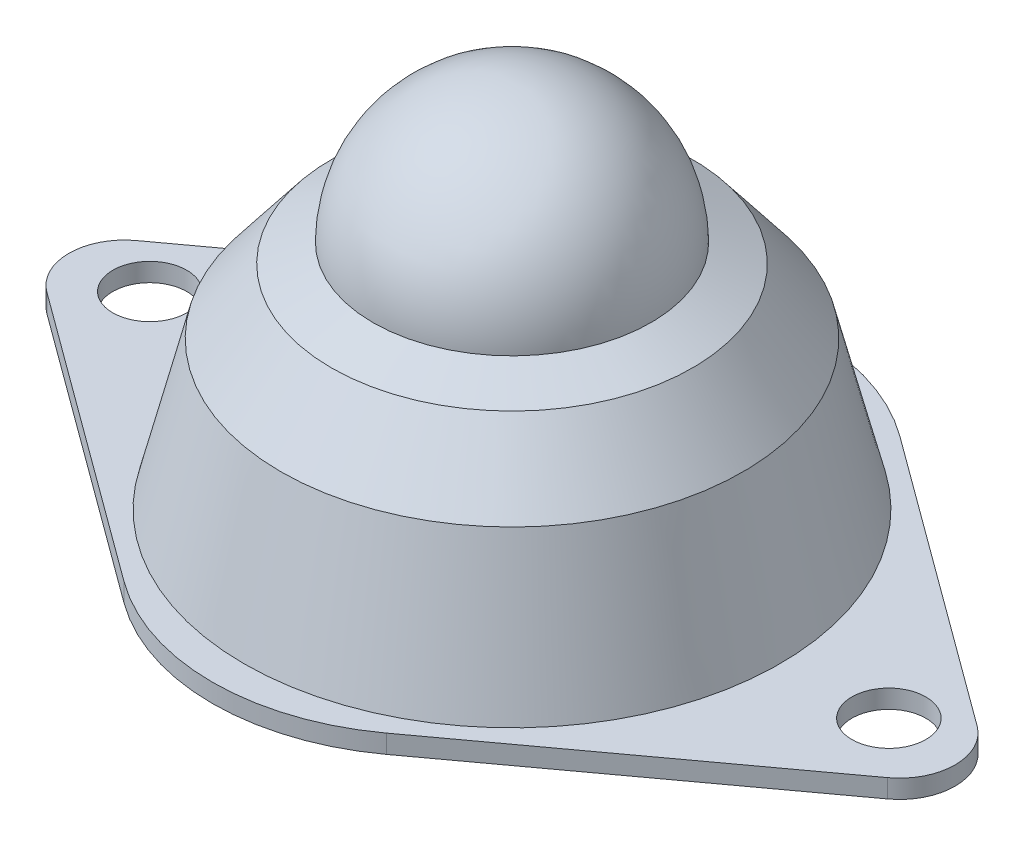
ISO-10303-21;
HEADER;
FILE_DESCRIPTION(('STEP AP214'),'2;1');
FILE_NAME('part.step','',(''),(''),'','','');
FILE_SCHEMA(('AUTOMOTIVE_DESIGN { 1 0 10303 214 1 1 1 1 }'));
ENDSEC;
DATA;
#1=APPLICATION_CONTEXT('core data for automotive mechanical design processes');
#2=APPLICATION_PROTOCOL_DEFINITION('international standard','automotive_design',2000,#1);
#3=PRODUCT_CONTEXT('',#1,'mechanical');
#4=PRODUCT('Part','Part','',(#3));
#5=PRODUCT_RELATED_PRODUCT_CATEGORY('part','',(#4));
#6=PRODUCT_DEFINITION_FORMATION('','',#4);
#7=PRODUCT_DEFINITION_CONTEXT('part definition',#1,'design');
#8=PRODUCT_DEFINITION('design','',#6,#7);
#9=PRODUCT_DEFINITION_SHAPE('','',#8);
#10=(LENGTH_UNIT() NAMED_UNIT(*) SI_UNIT(.MILLI.,.METRE.));
#11=(NAMED_UNIT(*) PLANE_ANGLE_UNIT() SI_UNIT($,.RADIAN.));
#12=(NAMED_UNIT(*) SI_UNIT($,.STERADIAN.) SOLID_ANGLE_UNIT());
#13=UNCERTAINTY_MEASURE_WITH_UNIT(LENGTH_MEASURE(1.E-05),#10,'distance_accuracy_value','');
#14=(GEOMETRIC_REPRESENTATION_CONTEXT(3) GLOBAL_UNCERTAINTY_ASSIGNED_CONTEXT((#13)) GLOBAL_UNIT_ASSIGNED_CONTEXT((#10,
#11,#12)) REPRESENTATION_CONTEXT('',''));
#15=CARTESIAN_POINT('',(0.,0.,0.));
#16=DIRECTION('',(0.,0.,1.));
#17=DIRECTION('',(1.,0.,0.));
#18=AXIS2_PLACEMENT_3D('',#15,#16,#17);
#19=CARTESIAN_POINT('',(0.,1.,0.));
#20=DIRECTION('',(0.,1.,0.));
#21=DIRECTION('',(0.,0.,1.));
#22=AXIS2_PLACEMENT_3D('',#19,#20,#21);
#23=PLANE('',#22);
#24=DIRECTION('',(-0.80645420799197,0.,-0.591296550312992));
#25=VECTOR('',#24,1.);
#26=CARTESIAN_POINT('',(0.,1.,-19.1));
#27=LINE('',#26,#25);
#28=CARTESIAN_POINT('',(22.7502933845774,1.,-2.41936288062244));
#29=VERTEX_POINT('',#28);
#30=CARTESIAN_POINT('',(7.09555871292742,1.,-13.8974982982058));
#31=VERTEX_POINT('',#30);
#32=EDGE_CURVE('E122',#29,#31,#27,.T.);
#33=ORIENTED_EDGE('',*,*,#32,.T.);
#34=CARTESIAN_POINT('',(1.09171512108208E-07,1.,-4.22004780230221));
#35=DIRECTION('',(0.,1.,0.));
#36=DIRECTION('',(0.,0.,1.));
#37=AXIS2_PLACEMENT_3D('',#34,#35,#36);
#38=CIRCLE('',#37,12.);
#39=CARTESIAN_POINT('',(-7.0955586365878,1.,-13.8974981940882));
#40=VERTEX_POINT('',#39);
#41=EDGE_CURVE('E164',#31,#40,#38,.T.);
#42=ORIENTED_EDGE('',*,*,#41,.T.);
#43=DIRECTION('',(-0.806454199315498,0.,0.591296562146609));
#44=VECTOR('',#43,1.);
#45=CARTESIAN_POINT('',(-26.05,1.,2.93870584186963E-07));
#46=LINE('',#45,#44);
#47=CARTESIAN_POINT('',(-22.7502934200782,1.,-2.41936234129997));
#48=VERTEX_POINT('',#47);
#49=EDGE_CURVE('E218',#40,#48,#46,.T.);
#50=ORIENTED_EDGE('',*,*,#49,.T.);
#51=CARTESIAN_POINT('',(-20.9764037336384,1.,2.56646526079762E-07));
#52=DIRECTION('',(0.,1.,0.));
#53=DIRECTION('',(0.,0.,1.));
#54=AXIS2_PLACEMENT_3D('',#51,#52,#53);
#55=CIRCLE('',#54,3.);
#56=CARTESIAN_POINT('',(-22.7502933845774,1.,2.41936288062243));
#57=VERTEX_POINT('',#56);
#58=EDGE_CURVE('E145',#48,#57,#55,.T.);
#59=ORIENTED_EDGE('',*,*,#58,.T.);
#60=DIRECTION('',(0.80645420799197,0.,0.591296550312992));
#61=VECTOR('',#60,1.);
#62=CARTESIAN_POINT('',(-26.05,1.,2.93870584186963E-07));
#63=LINE('',#62,#61);
#64=CARTESIAN_POINT('',(-7.09555871292742,1.,13.8974982982058));
#65=VERTEX_POINT('',#64);
#66=EDGE_CURVE('E216',#57,#65,#63,.T.);
#67=ORIENTED_EDGE('',*,*,#66,.T.);
#68=CARTESIAN_POINT('',(-1.09171517312379E-07,1.,4.2200478023022));
#69=DIRECTION('',(0.,1.,0.));
#70=DIRECTION('',(0.,0.,1.));
#71=AXIS2_PLACEMENT_3D('',#68,#69,#70);
#72=CIRCLE('',#71,12.);
#73=CARTESIAN_POINT('',(7.0955586365878,1.,13.8974981940882));
#74=VERTEX_POINT('',#73);
#75=EDGE_CURVE('E57',#65,#74,#72,.T.);
#76=ORIENTED_EDGE('',*,*,#75,.T.);
#77=DIRECTION('',(0.806454199315498,0.,-0.59129656214661));
#78=VECTOR('',#77,1.);
#79=CARTESIAN_POINT('',(0.,1.,19.1));
#80=LINE('',#79,#78);
#81=CARTESIAN_POINT('',(22.7502934200782,1.,2.41936234129997));
#82=VERTEX_POINT('',#81);
#83=EDGE_CURVE('E123',#74,#82,#80,.T.);
#84=ORIENTED_EDGE('',*,*,#83,.T.);
#85=CARTESIAN_POINT('',(20.9764037336384,1.,-2.56646526947124E-07));
#86=DIRECTION('',(0.,1.,0.));
#87=DIRECTION('',(0.,0.,1.));
#88=AXIS2_PLACEMENT_3D('',#85,#86,#87);
#89=CIRCLE('',#88,3.);
#90=EDGE_CURVE('E147',#82,#29,#89,.T.);
#91=ORIENTED_EDGE('',*,*,#90,.T.);
#92=EDGE_LOOP('',(#33,#42,#50,#59,#67,#76,#84,#91));
#93=FACE_BOUND('',#92,.T.);
#94=CARTESIAN_POINT('',(-19.9960750308674,1.,-0.396211256681049));
#95=DIRECTION('',(0.,1.,0.));
#96=DIRECTION('',(0.,0.,1.));
#97=AXIS2_PLACEMENT_3D('',#94,#95,#96);
#98=CIRCLE('',#97,2.);
#99=CARTESIAN_POINT('',(-19.9960750308674,1.,1.60378874331895));
#100=VERTEX_POINT('',#99);
#101=EDGE_CURVE('E134',#100,#100,#98,.T.);
#102=ORIENTED_EDGE('',*,*,#101,.F.);
#103=EDGE_LOOP('',(#102));
#104=FACE_BOUND('',#103,.T.);
#105=CARTESIAN_POINT('',(19.9960750250536,1.,-0.396211550096137));
#106=DIRECTION('',(0.,1.,0.));
#107=DIRECTION('',(0.,0.,1.));
#108=AXIS2_PLACEMENT_3D('',#105,#106,#107);
#109=CIRCLE('',#108,2.);
#110=CARTESIAN_POINT('',(19.9960750250536,1.,1.60378844990387));
#111=VERTEX_POINT('',#110);
#112=EDGE_CURVE('E225',#111,#111,#109,.T.);
#113=ORIENTED_EDGE('',*,*,#112,.F.);
#114=EDGE_LOOP('',(#113));
#115=FACE_BOUND('',#114,.T.);
#116=CARTESIAN_POINT('',(0.,1.,0.));
#117=DIRECTION('',(0.,1.,0.));
#118=DIRECTION('',(0.,0.,1.));
#119=AXIS2_PLACEMENT_3D('',#116,#117,#118);
#120=CIRCLE('',#119,14.5);
#121=CARTESIAN_POINT('',(0.,1.,14.5));
#122=VERTEX_POINT('',#121);
#123=EDGE_CURVE('E233',#122,#122,#120,.T.);
#124=ORIENTED_EDGE('',*,*,#123,.F.);
#125=EDGE_LOOP('',(#124));
#126=FACE_BOUND('',#125,.T.);
#127=ADVANCED_FACE('F36',(#93,#104,#115,#126),#23,.T.);
#128=CARTESIAN_POINT('',(0.,1.,-19.1));
#129=DIRECTION('',(-0.591296550312992,0.,0.80645420799197));
#130=DIRECTION('',(0.80645420799197,0.,0.591296550312992));
#131=AXIS2_PLACEMENT_3D('',#128,#129,#130);
#132=PLANE('',#131);
#133=DIRECTION('',(-0.80645420799197,0.,-0.591296550312992));
#134=VECTOR('',#133,1.);
#135=CARTESIAN_POINT('',(0.,0.,-19.1));
#136=LINE('',#135,#134);
#137=CARTESIAN_POINT('',(22.7502933845774,0.,-2.41936288062244));
#138=VERTEX_POINT('',#137);
#139=CARTESIAN_POINT('',(7.09555871292742,0.,-13.8974982982058));
#140=VERTEX_POINT('',#139);
#141=EDGE_CURVE('E119',#138,#140,#136,.T.);
#142=ORIENTED_EDGE('',*,*,#141,.T.);
#143=DIRECTION('',(0.,-1.,0.));
#144=VECTOR('',#143,1.);
#145=CARTESIAN_POINT('',(7.09555871292742,1.,-13.8974982982058));
#146=LINE('',#145,#144);
#147=EDGE_CURVE('E161',#140,#31,#146,.F.);
#148=ORIENTED_EDGE('',*,*,#147,.T.);
#149=ORIENTED_EDGE('',*,*,#32,.F.);
#150=DIRECTION('',(0.,-1.,0.));
#151=VECTOR('',#150,1.);
#152=CARTESIAN_POINT('',(22.7502933845774,1.,-2.41936288062243));
#153=LINE('',#152,#151);
#154=EDGE_CURVE('E107',#29,#138,#153,.T.);
#155=ORIENTED_EDGE('',*,*,#154,.T.);
#156=EDGE_LOOP('',(#142,#148,#149,#155));
#157=FACE_BOUND('',#156,.T.);
#158=ADVANCED_FACE('F118',(#157),#132,.F.);
#159=CARTESIAN_POINT('',(-26.05,1.,2.93870584186963E-07));
#160=DIRECTION('',(0.59129656214661,0.,0.806454199315498));
#161=DIRECTION('',(0.806454199315498,0.,-0.59129656214661));
#162=AXIS2_PLACEMENT_3D('',#159,#160,#161);
#163=PLANE('',#162);
#164=ORIENTED_EDGE('',*,*,#49,.F.);
#165=DIRECTION('',(0.,-1.,0.));
#166=VECTOR('',#165,1.);
#167=CARTESIAN_POINT('',(-7.0955586365878,1.,-13.8974981940882));
#168=LINE('',#167,#166);
#169=CARTESIAN_POINT('',(-7.0955586365878,0.,-13.8974981940882));
#170=VERTEX_POINT('',#169);
#171=EDGE_CURVE('E155',#40,#170,#168,.T.);
#172=ORIENTED_EDGE('',*,*,#171,.T.);
#173=DIRECTION('',(-0.806454199315498,0.,0.591296562146609));
#174=VECTOR('',#173,1.);
#175=CARTESIAN_POINT('',(-26.05,0.,2.93870584186963E-07));
#176=LINE('',#175,#174);
#177=CARTESIAN_POINT('',(-22.7502934200782,0.,-2.41936234129997));
#178=VERTEX_POINT('',#177);
#179=EDGE_CURVE('E128',#170,#178,#176,.T.);
#180=ORIENTED_EDGE('',*,*,#179,.T.);
#181=DIRECTION('',(0.,-1.,0.));
#182=VECTOR('',#181,1.);
#183=CARTESIAN_POINT('',(-22.7502934200782,1.,-2.41936234129997));
#184=LINE('',#183,#182);
#185=EDGE_CURVE('E152',#178,#48,#184,.F.);
#186=ORIENTED_EDGE('',*,*,#185,.T.);
#187=EDGE_LOOP('',(#164,#172,#180,#186));
#188=FACE_BOUND('',#187,.T.);
#189=ADVANCED_FACE('F193',(#188),#163,.F.);
#190=CARTESIAN_POINT('',(-26.05,1.,2.93870584186963E-07));
#191=DIRECTION('',(0.591296550312992,0.,-0.80645420799197));
#192=DIRECTION('',(-0.80645420799197,0.,-0.591296550312992));
#193=AXIS2_PLACEMENT_3D('',#190,#191,#192);
#194=PLANE('',#193);
#195=DIRECTION('',(0.80645420799197,0.,0.591296550312992));
#196=VECTOR('',#195,1.);
#197=CARTESIAN_POINT('',(-26.05,0.,2.93870584186963E-07));
#198=LINE('',#197,#196);
#199=CARTESIAN_POINT('',(-22.7502933845774,0.,2.41936288062243));
#200=VERTEX_POINT('',#199);
#201=CARTESIAN_POINT('',(-7.09555871292742,0.,13.8974982982058));
#202=VERTEX_POINT('',#201);
#203=EDGE_CURVE('E131',#200,#202,#198,.T.);
#204=ORIENTED_EDGE('',*,*,#203,.T.);
#205=DIRECTION('',(0.,-1.,0.));
#206=VECTOR('',#205,1.);
#207=CARTESIAN_POINT('',(-7.09555871292742,1.,13.8974982982058));
#208=LINE('',#207,#206);
#209=EDGE_CURVE('E11',#202,#65,#208,.F.);
#210=ORIENTED_EDGE('',*,*,#209,.T.);
#211=ORIENTED_EDGE('',*,*,#66,.F.);
#212=DIRECTION('',(0.,-1.,0.));
#213=VECTOR('',#212,1.);
#214=CARTESIAN_POINT('',(-22.7502933845774,1.,2.41936288062243));
#215=LINE('',#214,#213);
#216=EDGE_CURVE('E149',#57,#200,#215,.T.);
#217=ORIENTED_EDGE('',*,*,#216,.T.);
#218=EDGE_LOOP('',(#204,#210,#211,#217));
#219=FACE_BOUND('',#218,.T.);
#220=ADVANCED_FACE('F172',(#219),#194,.F.);
#221=CARTESIAN_POINT('',(0.,1.,19.1));
#222=DIRECTION('',(-0.59129656214661,0.,-0.806454199315498));
#223=DIRECTION('',(-0.806454199315498,0.,0.59129656214661));
#224=AXIS2_PLACEMENT_3D('',#221,#222,#223);
#225=PLANE('',#224);
#226=ORIENTED_EDGE('',*,*,#83,.F.);
#227=DIRECTION('',(0.,-1.,0.));
#228=VECTOR('',#227,1.);
#229=CARTESIAN_POINT('',(7.0955586365878,1.,13.8974981940882));
#230=LINE('',#229,#228);
#231=CARTESIAN_POINT('',(7.0955586365878,0.,13.8974981940882));
#232=VERTEX_POINT('',#231);
#233=EDGE_CURVE('E45',#74,#232,#230,.T.);
#234=ORIENTED_EDGE('',*,*,#233,.T.);
#235=DIRECTION('',(0.806454199315498,0.,-0.59129656214661));
#236=VECTOR('',#235,1.);
#237=CARTESIAN_POINT('',(0.,0.,19.1));
#238=LINE('',#237,#236);
#239=CARTESIAN_POINT('',(22.7502934200782,0.,2.41936234129997));
#240=VERTEX_POINT('',#239);
#241=EDGE_CURVE('E140',#232,#240,#238,.T.);
#242=ORIENTED_EDGE('',*,*,#241,.T.);
#243=DIRECTION('',(0.,-1.,0.));
#244=VECTOR('',#243,1.);
#245=CARTESIAN_POINT('',(22.7502934200782,1.,2.41936234129997));
#246=LINE('',#245,#244);
#247=EDGE_CURVE('E109',#240,#82,#246,.F.);
#248=ORIENTED_EDGE('',*,*,#247,.T.);
#249=EDGE_LOOP('',(#226,#234,#242,#248));
#250=FACE_BOUND('',#249,.T.);
#251=ADVANCED_FACE('F169',(#250),#225,.F.);
#252=CARTESIAN_POINT('',(0.,0.,0.));
#253=DIRECTION('',(0.,1.,0.));
#254=DIRECTION('',(0.,0.,1.));
#255=AXIS2_PLACEMENT_3D('',#252,#253,#254);
#256=PLANE('',#255);
#257=CARTESIAN_POINT('',(19.9960750250536,0.,-0.396211550096137));
#258=DIRECTION('',(0.,1.,0.));
#259=DIRECTION('',(0.,0.,1.));
#260=AXIS2_PLACEMENT_3D('',#257,#258,#259);
#261=CIRCLE('',#260,2.);
#262=CARTESIAN_POINT('',(19.9960750250536,0.,1.60378844990387));
#263=VERTEX_POINT('',#262);
#264=EDGE_CURVE('E223',#263,#263,#261,.T.);
#265=ORIENTED_EDGE('',*,*,#264,.T.);
#266=EDGE_LOOP('',(#265));
#267=FACE_BOUND('',#266,.T.);
#268=CARTESIAN_POINT('',(-19.9960750308674,0.,-0.396211256681049));
#269=DIRECTION('',(0.,1.,0.));
#270=DIRECTION('',(0.,0.,1.));
#271=AXIS2_PLACEMENT_3D('',#268,#269,#270);
#272=CIRCLE('',#271,2.);
#273=CARTESIAN_POINT('',(-19.9960750308674,0.,1.60378874331895));
#274=VERTEX_POINT('',#273);
#275=EDGE_CURVE('E129',#274,#274,#272,.T.);
#276=ORIENTED_EDGE('',*,*,#275,.T.);
#277=EDGE_LOOP('',(#276));
#278=FACE_BOUND('',#277,.T.);
#279=ORIENTED_EDGE('',*,*,#179,.F.);
#280=CARTESIAN_POINT('',(1.09171512108208E-07,0.,-4.22004780230221));
#281=DIRECTION('',(0.,1.,0.));
#282=DIRECTION('',(0.,0.,1.));
#283=AXIS2_PLACEMENT_3D('',#280,#281,#282);
#284=CIRCLE('',#283,12.);
#285=EDGE_CURVE('E127',#170,#140,#284,.F.);
#286=ORIENTED_EDGE('',*,*,#285,.T.);
#287=ORIENTED_EDGE('',*,*,#141,.F.);
#288=CARTESIAN_POINT('',(20.9764037336384,0.,-2.56646526947124E-07));
#289=DIRECTION('',(0.,1.,0.));
#290=DIRECTION('',(0.,0.,1.));
#291=AXIS2_PLACEMENT_3D('',#288,#289,#290);
#292=CIRCLE('',#291,3.);
#293=EDGE_CURVE('E103',#138,#240,#292,.F.);
#294=ORIENTED_EDGE('',*,*,#293,.T.);
#295=ORIENTED_EDGE('',*,*,#241,.F.);
#296=CARTESIAN_POINT('',(-1.09171517312379E-07,0.,4.2200478023022));
#297=DIRECTION('',(0.,1.,0.));
#298=DIRECTION('',(0.,0.,1.));
#299=AXIS2_PLACEMENT_3D('',#296,#297,#298);
#300=CIRCLE('',#299,12.);
#301=EDGE_CURVE('E158',#232,#202,#300,.F.);
#302=ORIENTED_EDGE('',*,*,#301,.T.);
#303=ORIENTED_EDGE('',*,*,#203,.F.);
#304=CARTESIAN_POINT('',(-20.9764037336384,0.,2.56646526079762E-07));
#305=DIRECTION('',(0.,1.,0.));
#306=DIRECTION('',(0.,0.,1.));
#307=AXIS2_PLACEMENT_3D('',#304,#305,#306);
#308=CIRCLE('',#307,3.);
#309=EDGE_CURVE('E113',#200,#178,#308,.F.);
#310=ORIENTED_EDGE('',*,*,#309,.T.);
#311=EDGE_LOOP('',(#279,#286,#287,#294,#295,#302,#303,#310));
#312=FACE_BOUND('',#311,.T.);
#313=ADVANCED_FACE('F126',(#267,#278,#312),#256,.F.);
#314=CARTESIAN_POINT('',(20.9764037336384,1.,-2.56646526947124E-07));
#315=DIRECTION('',(0.,-1.,0.));
#316=DIRECTION('',(0.,0.,-1.));
#317=AXIS2_PLACEMENT_3D('',#314,#315,#316);
#318=CYLINDRICAL_SURFACE('',#317,3.);
#319=ORIENTED_EDGE('',*,*,#90,.F.);
#320=ORIENTED_EDGE('',*,*,#247,.F.);
#321=ORIENTED_EDGE('',*,*,#293,.F.);
#322=ORIENTED_EDGE('',*,*,#154,.F.);
#323=EDGE_LOOP('',(#319,#320,#321,#322));
#324=FACE_BOUND('',#323,.T.);
#325=ADVANCED_FACE('F106',(#324),#318,.T.);
#326=CARTESIAN_POINT('',(-20.9764037336384,1.,2.56646526079762E-07));
#327=DIRECTION('',(0.,-1.,0.));
#328=DIRECTION('',(0.,0.,-1.));
#329=AXIS2_PLACEMENT_3D('',#326,#327,#328);
#330=CYLINDRICAL_SURFACE('',#329,3.);
#331=ORIENTED_EDGE('',*,*,#58,.F.);
#332=ORIENTED_EDGE('',*,*,#185,.F.);
#333=ORIENTED_EDGE('',*,*,#309,.F.);
#334=ORIENTED_EDGE('',*,*,#216,.F.);
#335=EDGE_LOOP('',(#331,#332,#333,#334));
#336=FACE_BOUND('',#335,.T.);
#337=ADVANCED_FACE('F185',(#336),#330,.T.);
#338=CARTESIAN_POINT('',(1.09171512108208E-07,1.,-4.22004780230221));
#339=DIRECTION('',(0.,-1.,0.));
#340=DIRECTION('',(0.,0.,-1.));
#341=AXIS2_PLACEMENT_3D('',#338,#339,#340);
#342=CYLINDRICAL_SURFACE('',#341,12.);
#343=ORIENTED_EDGE('',*,*,#41,.F.);
#344=ORIENTED_EDGE('',*,*,#147,.F.);
#345=ORIENTED_EDGE('',*,*,#285,.F.);
#346=ORIENTED_EDGE('',*,*,#171,.F.);
#347=EDGE_LOOP('',(#343,#344,#345,#346));
#348=FACE_BOUND('',#347,.T.);
#349=ADVANCED_FACE('F177',(#348),#342,.T.);
#350=CARTESIAN_POINT('',(-1.09171517312379E-07,1.,4.2200478023022));
#351=DIRECTION('',(0.,-1.,0.));
#352=DIRECTION('',(0.,0.,-1.));
#353=AXIS2_PLACEMENT_3D('',#350,#351,#352);
#354=CYLINDRICAL_SURFACE('',#353,12.);
#355=ORIENTED_EDGE('',*,*,#75,.F.);
#356=ORIENTED_EDGE('',*,*,#209,.F.);
#357=ORIENTED_EDGE('',*,*,#301,.F.);
#358=ORIENTED_EDGE('',*,*,#233,.F.);
#359=EDGE_LOOP('',(#355,#356,#357,#358));
#360=FACE_BOUND('',#359,.T.);
#361=ADVANCED_FACE('F174',(#360),#354,.T.);
#362=CARTESIAN_POINT('',(-19.9960750308674,0.,-0.396211256681049));
#363=DIRECTION('',(0.,1.,0.));
#364=DIRECTION('',(0.,0.,1.));
#365=AXIS2_PLACEMENT_3D('',#362,#363,#364);
#366=CYLINDRICAL_SURFACE('',#365,2.);
#367=ORIENTED_EDGE('',*,*,#275,.F.);
#368=EDGE_LOOP('',(#367));
#369=FACE_BOUND('',#368,.T.);
#370=ORIENTED_EDGE('',*,*,#101,.T.);
#371=EDGE_LOOP('',(#370));
#372=FACE_BOUND('',#371,.T.);
#373=ADVANCED_FACE('F176',(#369,#372),#366,.F.);
#374=CARTESIAN_POINT('',(19.9960750250536,0.,-0.396211550096137));
#375=DIRECTION('',(0.,1.,0.));
#376=DIRECTION('',(0.,0.,1.));
#377=AXIS2_PLACEMENT_3D('',#374,#375,#376);
#378=CYLINDRICAL_SURFACE('',#377,2.);
#379=ORIENTED_EDGE('',*,*,#264,.F.);
#380=EDGE_LOOP('',(#379));
#381=FACE_BOUND('',#380,.T.);
#382=ORIENTED_EDGE('',*,*,#112,.T.);
#383=EDGE_LOOP('',(#382));
#384=FACE_BOUND('',#383,.T.);
#385=ADVANCED_FACE('F182',(#381,#384),#378,.F.);
#386=CARTESIAN_POINT('',(0.,1.,0.));
#387=DIRECTION('',(0.,-1.,0.));
#388=DIRECTION('',(0.,0.,1.));
#389=AXIS2_PLACEMENT_3D('',#386,#387,#388);
#390=CONICAL_SURFACE('',#389,14.5,0.244346095279206);
#391=CARTESIAN_POINT('',(0.,9.,0.));
#392=DIRECTION('',(0.,1.,0.));
#393=DIRECTION('',(0.,0.,1.));
#394=AXIS2_PLACEMENT_3D('',#391,#392,#393);
#395=CIRCLE('',#394,12.5053759772546);
#396=CARTESIAN_POINT('',(0.,9.,12.5053759772546));
#397=VERTEX_POINT('',#396);
#398=EDGE_CURVE('E228',#397,#397,#395,.T.);
#399=ORIENTED_EDGE('',*,*,#398,.F.);
#400=EDGE_LOOP('',(#399));
#401=FACE_BOUND('',#400,.T.);
#402=ORIENTED_EDGE('',*,*,#123,.T.);
#403=EDGE_LOOP('',(#402));
#404=FACE_BOUND('',#403,.T.);
#405=ADVANCED_FACE('F252',(#401,#404),#390,.T.);
#406=CARTESIAN_POINT('',(0.,9.,0.));
#407=DIRECTION('',(0.,-1.,0.));
#408=DIRECTION('',(0.,0.,1.));
#409=AXIS2_PLACEMENT_3D('',#406,#407,#408);
#410=CONICAL_SURFACE('',#409,12.5053759772546,0.663225115757846);
#411=CARTESIAN_POINT('',(0.,12.5,0.));
#412=DIRECTION('',(0.,1.,0.));
#413=DIRECTION('',(0.,0.,1.));
#414=AXIS2_PLACEMENT_3D('',#411,#412,#413);
#415=CIRCLE('',#414,9.77087628448104);
#416=CARTESIAN_POINT('',(0.,12.5,9.77087628448104));
#417=VERTEX_POINT('',#416);
#418=EDGE_CURVE('E236',#417,#417,#415,.T.);
#419=ORIENTED_EDGE('',*,*,#418,.F.);
#420=EDGE_LOOP('',(#419));
#421=FACE_BOUND('',#420,.T.);
#422=ORIENTED_EDGE('',*,*,#398,.T.);
#423=EDGE_LOOP('',(#422));
#424=FACE_BOUND('',#423,.T.);
#425=ADVANCED_FACE('F246',(#421,#424),#410,.T.);
#426=CARTESIAN_POINT('',(0.,12.5,0.));
#427=DIRECTION('',(0.,-1.,0.));
#428=DIRECTION('',(0.,0.,1.));
#429=AXIS2_PLACEMENT_3D('',#426,#427,#428);
#430=CONICAL_SURFACE('',#429,9.77087628448104,1.15191730631626);
#431=CARTESIAN_POINT('',(0.,13.5,0.));
#432=DIRECTION('',(0.,1.,0.));
#433=DIRECTION('',(0.,0.,1.));
#434=AXIS2_PLACEMENT_3D('',#431,#432,#433);
#435=CIRCLE('',#434,7.52483951057681);
#436=CARTESIAN_POINT('',(0.,13.5,7.52483951057681));
#437=VERTEX_POINT('',#436);
#438=EDGE_CURVE('E40',#437,#437,#435,.T.);
#439=ORIENTED_EDGE('',*,*,#438,.F.);
#440=EDGE_LOOP('',(#439));
#441=FACE_BOUND('',#440,.T.);
#442=ORIENTED_EDGE('',*,*,#418,.T.);
#443=EDGE_LOOP('',(#442));
#444=FACE_BOUND('',#443,.T.);
#445=ADVANCED_FACE('F244',(#441,#444),#430,.T.);
#446=CARTESIAN_POINT('',(0.,13.4751193560041,0.));
#447=DIRECTION('',(0.,0.,1.));
#448=DIRECTION('',(1.,0.,0.));
#449=AXIS2_PLACEMENT_3D('',#446,#447,#448);
#450=SPHERICAL_SURFACE('',#449,7.52488064399585);
#451=CARTESIAN_POINT('',(0.,13.4751193560041,0.));
#452=DIRECTION('',(0.,1.,0.));
#453=DIRECTION('',(0.,0.,1.));
#454=AXIS2_PLACEMENT_3D('',#451,#452,#453);
#455=SPHERICAL_SURFACE('',#454,7.52488064399585);
#456=ORIENTED_EDGE('',*,*,#438,.T.);
#457=EDGE_LOOP('',(#456));
#458=FACE_BOUND('',#457,.T.);
#459=ADVANCED_FACE('F38',(#458),#455,.T.);
#460=CLOSED_SHELL('',(#127,#158,#189,#220,#251,#313,#325,#337,#349,#361,#373,#385,#405,#425,
#445,#459));
#461=MANIFOLD_SOLID_BREP('B2',#460);
#462=ADVANCED_BREP_SHAPE_REPRESENTATION('',(#18,#461),#14);
#463=SHAPE_DEFINITION_REPRESENTATION(#9,#462);
ENDSEC;
END-ISO-10303-21;
